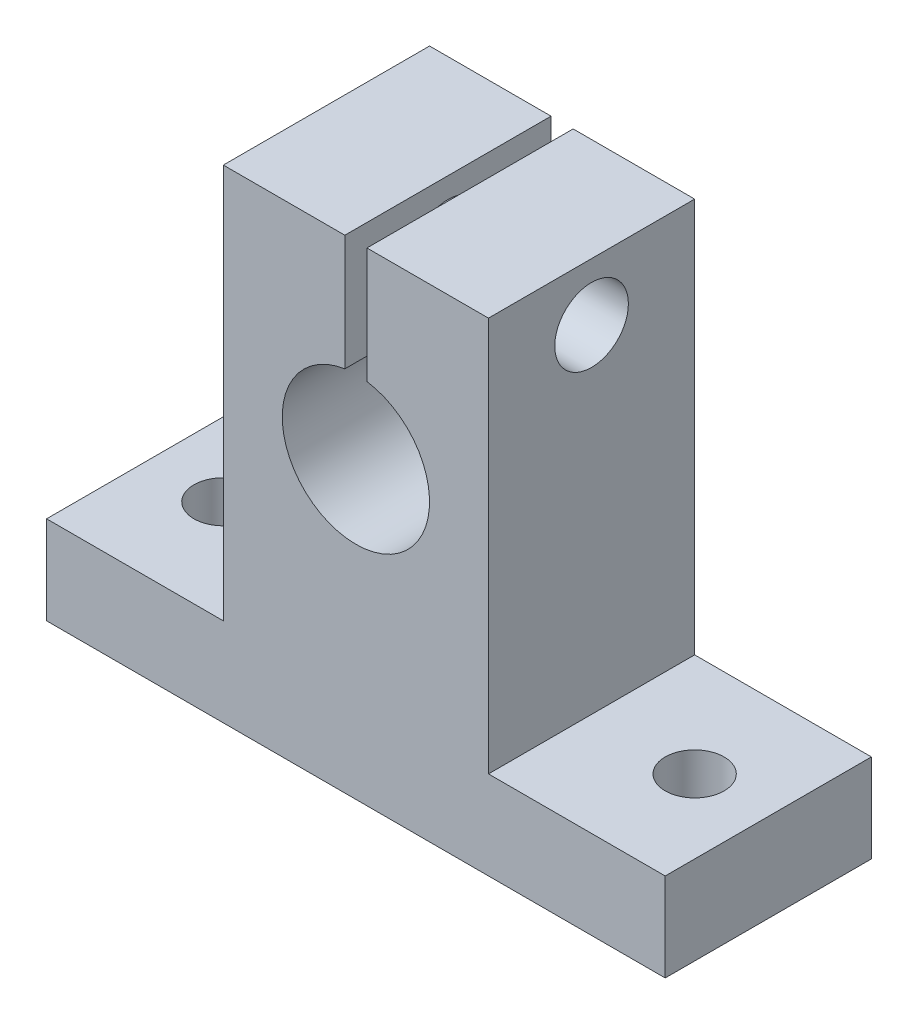
ISO-10303-21;
HEADER;
FILE_DESCRIPTION(('STEP AP214'),'2;1');
FILE_NAME('part.step','',(''),(''),'','','');
FILE_SCHEMA(('AUTOMOTIVE_DESIGN { 1 0 10303 214 1 1 1 1 }'));
ENDSEC;
DATA;
#1=APPLICATION_CONTEXT('core data for automotive mechanical design processes');
#2=APPLICATION_PROTOCOL_DEFINITION('international standard','automotive_design',2000,#1);
#3=PRODUCT_CONTEXT('',#1,'mechanical');
#4=PRODUCT('Part','Part','',(#3));
#5=PRODUCT_RELATED_PRODUCT_CATEGORY('part','',(#4));
#6=PRODUCT_DEFINITION_FORMATION('','',#4);
#7=PRODUCT_DEFINITION_CONTEXT('part definition',#1,'design');
#8=PRODUCT_DEFINITION('design','',#6,#7);
#9=PRODUCT_DEFINITION_SHAPE('','',#8);
#10=(LENGTH_UNIT() NAMED_UNIT(*) SI_UNIT(.MILLI.,.METRE.));
#11=(NAMED_UNIT(*) PLANE_ANGLE_UNIT() SI_UNIT($,.RADIAN.));
#12=(NAMED_UNIT(*) SI_UNIT($,.STERADIAN.) SOLID_ANGLE_UNIT());
#13=UNCERTAINTY_MEASURE_WITH_UNIT(LENGTH_MEASURE(1.E-05),#10,'distance_accuracy_value','');
#14=(GEOMETRIC_REPRESENTATION_CONTEXT(3) GLOBAL_UNCERTAINTY_ASSIGNED_CONTEXT((#13)) GLOBAL_UNIT_ASSIGNED_CONTEXT((#10,
#11,#12)) REPRESENTATION_CONTEXT('',''));
#15=CARTESIAN_POINT('',(0.,0.,0.));
#16=DIRECTION('',(0.,0.,1.));
#17=DIRECTION('',(1.,0.,0.));
#18=AXIS2_PLACEMENT_3D('',#15,#16,#17);
#19=CARTESIAN_POINT('',(0.749999999999995,16.4,14.));
#20=DIRECTION('',(0.,-1.,0.));
#21=DIRECTION('',(0.,0.,-1.));
#22=AXIS2_PLACEMENT_3D('',#19,#20,#21);
#23=PLANE('',#22);
#24=DIRECTION('',(-1.,0.,0.));
#25=VECTOR('',#24,1.);
#26=CARTESIAN_POINT('',(0.749999999999995,16.4,0.));
#27=LINE('',#26,#25);
#28=CARTESIAN_POINT('',(9.,16.4,0.));
#29=VERTEX_POINT('',#28);
#30=CARTESIAN_POINT('',(0.749999999999995,16.4,0.));
#31=VERTEX_POINT('',#30);
#32=EDGE_CURVE('E165',#29,#31,#27,.T.);
#33=ORIENTED_EDGE('',*,*,#32,.T.);
#34=DIRECTION('',(0.,0.,-1.));
#35=VECTOR('',#34,1.);
#36=CARTESIAN_POINT('',(0.749999999999995,16.4,14.));
#37=LINE('',#36,#35);
#38=CARTESIAN_POINT('',(0.749999999999995,16.4,14.));
#39=VERTEX_POINT('',#38);
#40=EDGE_CURVE('E11',#39,#31,#37,.T.);
#41=ORIENTED_EDGE('',*,*,#40,.F.);
#42=DIRECTION('',(-1.,0.,0.));
#43=VECTOR('',#42,1.);
#44=CARTESIAN_POINT('',(0.749999999999995,16.4,14.));
#45=LINE('',#44,#43);
#46=CARTESIAN_POINT('',(9.,16.4,14.));
#47=VERTEX_POINT('',#46);
#48=EDGE_CURVE('E200',#47,#39,#45,.T.);
#49=ORIENTED_EDGE('',*,*,#48,.F.);
#50=DIRECTION('',(0.,0.,-1.));
#51=VECTOR('',#50,1.);
#52=CARTESIAN_POINT('',(9.,16.4,14.));
#53=LINE('',#52,#51);
#54=EDGE_CURVE('E161',#47,#29,#53,.T.);
#55=ORIENTED_EDGE('',*,*,#54,.T.);
#56=EDGE_LOOP('',(#33,#41,#49,#55));
#57=FACE_BOUND('',#56,.T.);
#58=ADVANCED_FACE('F39',(#57),#23,.F.);
#59=CARTESIAN_POINT('',(0.749999999999995,8.5434299833213,14.));
#60=DIRECTION('',(1.,0.,0.));
#61=DIRECTION('',(0.,0.,-1.));
#62=AXIS2_PLACEMENT_3D('',#59,#60,#61);
#63=PLANE('',#62);
#64=CARTESIAN_POINT('',(0.749999999999994,12.5,7.));
#65=DIRECTION('',(1.,0.,0.));
#66=DIRECTION('',(0.,0.,-1.));
#67=AXIS2_PLACEMENT_3D('',#64,#65,#66);
#68=CIRCLE('',#67,2.5);
#69=CARTESIAN_POINT('',(0.749999999999994,12.5,4.5));
#70=VERTEX_POINT('',#69);
#71=EDGE_CURVE('E170',#70,#70,#68,.T.);
#72=ORIENTED_EDGE('',*,*,#71,.T.);
#73=EDGE_LOOP('',(#72));
#74=FACE_BOUND('',#73,.T.);
#75=DIRECTION('',(0.,-1.,0.));
#76=VECTOR('',#75,1.);
#77=CARTESIAN_POINT('',(0.749999999999995,8.5434299833213,0.));
#78=LINE('',#77,#76);
#79=CARTESIAN_POINT('',(0.749999999999994,8.5434299833213,0.));
#80=VERTEX_POINT('',#79);
#81=EDGE_CURVE('E169',#31,#80,#78,.T.);
#82=ORIENTED_EDGE('',*,*,#81,.T.);
#83=DIRECTION('',(0.,0.,-1.));
#84=VECTOR('',#83,1.);
#85=CARTESIAN_POINT('',(0.749999999999994,8.5434299833213,14.));
#86=LINE('',#85,#84);
#87=CARTESIAN_POINT('',(0.749999999999994,8.5434299833213,14.));
#88=VERTEX_POINT('',#87);
#89=EDGE_CURVE('E49',#88,#80,#86,.T.);
#90=ORIENTED_EDGE('',*,*,#89,.F.);
#91=DIRECTION('',(0.,-1.,0.));
#92=VECTOR('',#91,1.);
#93=CARTESIAN_POINT('',(0.749999999999995,8.5434299833213,14.));
#94=LINE('',#93,#92);
#95=EDGE_CURVE('E112',#39,#88,#94,.T.);
#96=ORIENTED_EDGE('',*,*,#95,.F.);
#97=ORIENTED_EDGE('',*,*,#40,.T.);
#98=EDGE_LOOP('',(#82,#90,#96,#97));
#99=FACE_BOUND('',#98,.T.);
#100=ADVANCED_FACE('F298',(#74,#99),#63,.F.);
#101=CARTESIAN_POINT('',(0.,3.6,14.));
#102=DIRECTION('',(0.,0.,-1.));
#103=DIRECTION('',(-1.,0.,0.));
#104=AXIS2_PLACEMENT_3D('',#101,#102,#103);
#105=CYLINDRICAL_SURFACE('',#104,5.);
#106=CARTESIAN_POINT('',(0.,3.6,0.));
#107=DIRECTION('',(0.,0.,-1.));
#108=DIRECTION('',(1.,0.,0.));
#109=AXIS2_PLACEMENT_3D('',#106,#107,#108);
#110=CIRCLE('',#109,5.);
#111=CARTESIAN_POINT('',(-0.750000000000005,8.5434299833213,0.));
#112=VERTEX_POINT('',#111);
#113=EDGE_CURVE('E173',#80,#112,#110,.T.);
#114=ORIENTED_EDGE('',*,*,#113,.T.);
#115=DIRECTION('',(0.,0.,-1.));
#116=VECTOR('',#115,1.);
#117=CARTESIAN_POINT('',(-0.750000000000005,8.5434299833213,14.));
#118=LINE('',#117,#116);
#119=CARTESIAN_POINT('',(-0.750000000000005,8.5434299833213,14.));
#120=VERTEX_POINT('',#119);
#121=EDGE_CURVE('E227',#120,#112,#118,.T.);
#122=ORIENTED_EDGE('',*,*,#121,.F.);
#123=CARTESIAN_POINT('',(0.,3.6,14.));
#124=DIRECTION('',(0.,0.,-1.));
#125=DIRECTION('',(1.,0.,0.));
#126=AXIS2_PLACEMENT_3D('',#123,#124,#125);
#127=CIRCLE('',#126,5.);
#128=EDGE_CURVE('E238',#88,#120,#127,.T.);
#129=ORIENTED_EDGE('',*,*,#128,.F.);
#130=ORIENTED_EDGE('',*,*,#89,.T.);
#131=EDGE_LOOP('',(#114,#122,#129,#130));
#132=FACE_BOUND('',#131,.T.);
#133=ADVANCED_FACE('F236',(#132),#105,.F.);
#134=CARTESIAN_POINT('',(-0.750000000000005,8.5434299833213,14.));
#135=DIRECTION('',(-1.,0.,0.));
#136=DIRECTION('',(0.,0.,1.));
#137=AXIS2_PLACEMENT_3D('',#134,#135,#136);
#138=PLANE('',#137);
#139=CARTESIAN_POINT('',(-0.750000000000004,12.5,7.));
#140=DIRECTION('',(-1.,0.,0.));
#141=DIRECTION('',(0.,0.,1.));
#142=AXIS2_PLACEMENT_3D('',#139,#140,#141);
#143=CIRCLE('',#142,2.5);
#144=CARTESIAN_POINT('',(-0.750000000000004,12.5,9.5));
#145=VERTEX_POINT('',#144);
#146=EDGE_CURVE('E454',#145,#145,#143,.T.);
#147=ORIENTED_EDGE('',*,*,#146,.T.);
#148=EDGE_LOOP('',(#147));
#149=FACE_BOUND('',#148,.T.);
#150=DIRECTION('',(0.,1.,0.));
#151=VECTOR('',#150,1.);
#152=CARTESIAN_POINT('',(-0.750000000000005,8.5434299833213,0.));
#153=LINE('',#152,#151);
#154=CARTESIAN_POINT('',(-0.750000000000005,16.4,0.));
#155=VERTEX_POINT('',#154);
#156=EDGE_CURVE('E176',#112,#155,#153,.T.);
#157=ORIENTED_EDGE('',*,*,#156,.T.);
#158=DIRECTION('',(0.,0.,-1.));
#159=VECTOR('',#158,1.);
#160=CARTESIAN_POINT('',(-0.750000000000005,16.4,14.));
#161=LINE('',#160,#159);
#162=CARTESIAN_POINT('',(-0.750000000000005,16.4,14.));
#163=VERTEX_POINT('',#162);
#164=EDGE_CURVE('E223',#163,#155,#161,.T.);
#165=ORIENTED_EDGE('',*,*,#164,.F.);
#166=DIRECTION('',(0.,1.,0.));
#167=VECTOR('',#166,1.);
#168=CARTESIAN_POINT('',(-0.750000000000005,8.5434299833213,14.));
#169=LINE('',#168,#167);
#170=EDGE_CURVE('E257',#120,#163,#169,.T.);
#171=ORIENTED_EDGE('',*,*,#170,.F.);
#172=ORIENTED_EDGE('',*,*,#121,.T.);
#173=EDGE_LOOP('',(#157,#165,#171,#172));
#174=FACE_BOUND('',#173,.T.);
#175=ADVANCED_FACE('F247',(#149,#174),#138,.F.);
#176=CARTESIAN_POINT('',(-9.,16.4,14.));
#177=DIRECTION('',(0.,-1.,0.));
#178=DIRECTION('',(0.,0.,-1.));
#179=AXIS2_PLACEMENT_3D('',#176,#177,#178);
#180=PLANE('',#179);
#181=DIRECTION('',(-1.,0.,0.));
#182=VECTOR('',#181,1.);
#183=CARTESIAN_POINT('',(-9.,16.4,0.));
#184=LINE('',#183,#182);
#185=CARTESIAN_POINT('',(-9.,16.4,0.));
#186=VERTEX_POINT('',#185);
#187=EDGE_CURVE('E179',#155,#186,#184,.T.);
#188=ORIENTED_EDGE('',*,*,#187,.T.);
#189=DIRECTION('',(0.,0.,-1.));
#190=VECTOR('',#189,1.);
#191=CARTESIAN_POINT('',(-9.,16.4,14.));
#192=LINE('',#191,#190);
#193=CARTESIAN_POINT('',(-9.,16.4,14.));
#194=VERTEX_POINT('',#193);
#195=EDGE_CURVE('E219',#194,#186,#192,.T.);
#196=ORIENTED_EDGE('',*,*,#195,.F.);
#197=DIRECTION('',(-1.,0.,0.));
#198=VECTOR('',#197,1.);
#199=CARTESIAN_POINT('',(-9.,16.4,14.));
#200=LINE('',#199,#198);
#201=EDGE_CURVE('E253',#163,#194,#200,.T.);
#202=ORIENTED_EDGE('',*,*,#201,.F.);
#203=ORIENTED_EDGE('',*,*,#164,.T.);
#204=EDGE_LOOP('',(#188,#196,#202,#203));
#205=FACE_BOUND('',#204,.T.);
#206=ADVANCED_FACE('F251',(#205),#180,.F.);
#207=CARTESIAN_POINT('',(-9.,-10.4,14.));
#208=DIRECTION('',(1.,0.,0.));
#209=DIRECTION('',(0.,0.,-1.));
#210=AXIS2_PLACEMENT_3D('',#207,#208,#209);
#211=PLANE('',#210);
#212=CARTESIAN_POINT('',(-9.,12.5,7.));
#213=DIRECTION('',(1.,0.,0.));
#214=DIRECTION('',(0.,0.,-1.));
#215=AXIS2_PLACEMENT_3D('',#212,#213,#214);
#216=CIRCLE('',#215,2.5);
#217=CARTESIAN_POINT('',(-9.,12.5,4.5));
#218=VERTEX_POINT('',#217);
#219=EDGE_CURVE('E451',#218,#218,#216,.T.);
#220=ORIENTED_EDGE('',*,*,#219,.T.);
#221=EDGE_LOOP('',(#220));
#222=FACE_BOUND('',#221,.T.);
#223=DIRECTION('',(0.,-1.,0.));
#224=VECTOR('',#223,1.);
#225=CARTESIAN_POINT('',(-9.,-10.4,0.));
#226=LINE('',#225,#224);
#227=CARTESIAN_POINT('',(-9.,-10.4,0.));
#228=VERTEX_POINT('',#227);
#229=EDGE_CURVE('E182',#186,#228,#226,.T.);
#230=ORIENTED_EDGE('',*,*,#229,.T.);
#231=DIRECTION('',(0.,0.,-1.));
#232=VECTOR('',#231,1.);
#233=CARTESIAN_POINT('',(-9.,-10.4,14.));
#234=LINE('',#233,#232);
#235=CARTESIAN_POINT('',(-9.,-10.4,14.));
#236=VERTEX_POINT('',#235);
#237=EDGE_CURVE('E215',#236,#228,#234,.T.);
#238=ORIENTED_EDGE('',*,*,#237,.F.);
#239=DIRECTION('',(0.,-1.,0.));
#240=VECTOR('',#239,1.);
#241=CARTESIAN_POINT('',(-9.,-10.4,14.));
#242=LINE('',#241,#240);
#243=EDGE_CURVE('E256',#194,#236,#242,.T.);
#244=ORIENTED_EDGE('',*,*,#243,.F.);
#245=ORIENTED_EDGE('',*,*,#195,.T.);
#246=EDGE_LOOP('',(#230,#238,#244,#245));
#247=FACE_BOUND('',#246,.T.);
#248=ADVANCED_FACE('F314',(#222,#247),#211,.F.);
#249=CARTESIAN_POINT('',(-9.,-10.4,14.));
#250=DIRECTION('',(0.,-1.,0.));
#251=DIRECTION('',(1.,0.,0.));
#252=AXIS2_PLACEMENT_3D('',#249,#250,#251);
#253=PLANE('',#252);
#254=CARTESIAN_POINT('',(-16.,-10.4,7.));
#255=DIRECTION('',(0.,1.,0.));
#256=DIRECTION('',(-1.,0.,0.));
#257=AXIS2_PLACEMENT_3D('',#254,#255,#256);
#258=CIRCLE('',#257,2.);
#259=CARTESIAN_POINT('',(-18.,-10.4,7.));
#260=VERTEX_POINT('',#259);
#261=EDGE_CURVE('E475',#260,#260,#258,.T.);
#262=ORIENTED_EDGE('',*,*,#261,.F.);
#263=EDGE_LOOP('',(#262));
#264=FACE_BOUND('',#263,.T.);
#265=DIRECTION('',(-1.,0.,0.));
#266=VECTOR('',#265,1.);
#267=CARTESIAN_POINT('',(-9.,-10.4,0.));
#268=LINE('',#267,#266);
#269=CARTESIAN_POINT('',(-21.,-10.4,0.));
#270=VERTEX_POINT('',#269);
#271=EDGE_CURVE('E185',#228,#270,#268,.T.);
#272=ORIENTED_EDGE('',*,*,#271,.T.);
#273=DIRECTION('',(0.,0.,-1.));
#274=VECTOR('',#273,1.);
#275=CARTESIAN_POINT('',(-21.,-10.4,14.));
#276=LINE('',#275,#274);
#277=CARTESIAN_POINT('',(-21.,-10.4,14.));
#278=VERTEX_POINT('',#277);
#279=EDGE_CURVE('E211',#278,#270,#276,.T.);
#280=ORIENTED_EDGE('',*,*,#279,.F.);
#281=DIRECTION('',(-1.,0.,0.));
#282=VECTOR('',#281,1.);
#283=CARTESIAN_POINT('',(-9.,-10.4,14.));
#284=LINE('',#283,#282);
#285=EDGE_CURVE('E261',#236,#278,#284,.T.);
#286=ORIENTED_EDGE('',*,*,#285,.F.);
#287=ORIENTED_EDGE('',*,*,#237,.T.);
#288=EDGE_LOOP('',(#272,#280,#286,#287));
#289=FACE_BOUND('',#288,.T.);
#290=ADVANCED_FACE('F317',(#264,#289),#253,.F.);
#291=CARTESIAN_POINT('',(-21.,-16.4,14.));
#292=DIRECTION('',(1.,0.,0.));
#293=DIRECTION('',(0.,0.,-1.));
#294=AXIS2_PLACEMENT_3D('',#291,#292,#293);
#295=PLANE('',#294);
#296=DIRECTION('',(0.,-1.,0.));
#297=VECTOR('',#296,1.);
#298=CARTESIAN_POINT('',(-21.,-16.4,0.));
#299=LINE('',#298,#297);
#300=CARTESIAN_POINT('',(-21.,-16.4,0.));
#301=VERTEX_POINT('',#300);
#302=EDGE_CURVE('E188',#270,#301,#299,.T.);
#303=ORIENTED_EDGE('',*,*,#302,.T.);
#304=DIRECTION('',(0.,0.,-1.));
#305=VECTOR('',#304,1.);
#306=CARTESIAN_POINT('',(-21.,-16.4,14.));
#307=LINE('',#306,#305);
#308=CARTESIAN_POINT('',(-21.,-16.4,14.));
#309=VERTEX_POINT('',#308);
#310=EDGE_CURVE('E207',#309,#301,#307,.T.);
#311=ORIENTED_EDGE('',*,*,#310,.F.);
#312=DIRECTION('',(0.,-1.,0.));
#313=VECTOR('',#312,1.);
#314=CARTESIAN_POINT('',(-21.,-16.4,14.));
#315=LINE('',#314,#313);
#316=EDGE_CURVE('E268',#278,#309,#315,.T.);
#317=ORIENTED_EDGE('',*,*,#316,.F.);
#318=ORIENTED_EDGE('',*,*,#279,.T.);
#319=EDGE_LOOP('',(#303,#311,#317,#318));
#320=FACE_BOUND('',#319,.T.);
#321=ADVANCED_FACE('F276',(#320),#295,.F.);
#322=CARTESIAN_POINT('',(-21.,-16.4,14.));
#323=DIRECTION('',(0.,1.,0.));
#324=DIRECTION('',(0.,0.,1.));
#325=AXIS2_PLACEMENT_3D('',#322,#323,#324);
#326=PLANE('',#325);
#327=CARTESIAN_POINT('',(-16.,-16.4,7.));
#328=DIRECTION('',(0.,1.,0.));
#329=DIRECTION('',(0.,0.,1.));
#330=AXIS2_PLACEMENT_3D('',#327,#328,#329);
#331=CIRCLE('',#330,2.);
#332=CARTESIAN_POINT('',(-16.,-16.4,9.));
#333=VERTEX_POINT('',#332);
#334=EDGE_CURVE('E42',#333,#333,#331,.T.);
#335=ORIENTED_EDGE('',*,*,#334,.T.);
#336=EDGE_LOOP('',(#335));
#337=FACE_BOUND('',#336,.T.);
#338=CARTESIAN_POINT('',(16.,-16.4,7.));
#339=DIRECTION('',(0.,1.,0.));
#340=DIRECTION('',(0.,0.,1.));
#341=AXIS2_PLACEMENT_3D('',#338,#339,#340);
#342=CIRCLE('',#341,2.);
#343=CARTESIAN_POINT('',(16.,-16.4,9.));
#344=VERTEX_POINT('',#343);
#345=EDGE_CURVE('E471',#344,#344,#342,.T.);
#346=ORIENTED_EDGE('',*,*,#345,.T.);
#347=EDGE_LOOP('',(#346));
#348=FACE_BOUND('',#347,.T.);
#349=DIRECTION('',(1.,0.,0.));
#350=VECTOR('',#349,1.);
#351=CARTESIAN_POINT('',(-21.,-16.4,0.));
#352=LINE('',#351,#350);
#353=CARTESIAN_POINT('',(21.,-16.4,0.));
#354=VERTEX_POINT('',#353);
#355=EDGE_CURVE('E191',#301,#354,#352,.T.);
#356=ORIENTED_EDGE('',*,*,#355,.T.);
#357=DIRECTION('',(0.,0.,-1.));
#358=VECTOR('',#357,1.);
#359=CARTESIAN_POINT('',(21.,-16.4,14.));
#360=LINE('',#359,#358);
#361=CARTESIAN_POINT('',(21.,-16.4,14.));
#362=VERTEX_POINT('',#361);
#363=EDGE_CURVE('E154',#362,#354,#360,.T.);
#364=ORIENTED_EDGE('',*,*,#363,.F.);
#365=DIRECTION('',(1.,0.,0.));
#366=VECTOR('',#365,1.);
#367=CARTESIAN_POINT('',(-21.,-16.4,14.));
#368=LINE('',#367,#366);
#369=EDGE_CURVE('E143',#309,#362,#368,.T.);
#370=ORIENTED_EDGE('',*,*,#369,.F.);
#371=ORIENTED_EDGE('',*,*,#310,.T.);
#372=EDGE_LOOP('',(#356,#364,#370,#371));
#373=FACE_BOUND('',#372,.T.);
#374=ADVANCED_FACE('F280',(#337,#348,#373),#326,.F.);
#375=CARTESIAN_POINT('',(21.,-16.4,14.));
#376=DIRECTION('',(-1.,0.,0.));
#377=DIRECTION('',(0.,0.,1.));
#378=AXIS2_PLACEMENT_3D('',#375,#376,#377);
#379=PLANE('',#378);
#380=DIRECTION('',(0.,1.,0.));
#381=VECTOR('',#380,1.);
#382=CARTESIAN_POINT('',(21.,-16.4,0.));
#383=LINE('',#382,#381);
#384=CARTESIAN_POINT('',(21.,-10.4,0.));
#385=VERTEX_POINT('',#384);
#386=EDGE_CURVE('E152',#354,#385,#383,.T.);
#387=ORIENTED_EDGE('',*,*,#386,.T.);
#388=DIRECTION('',(0.,0.,-1.));
#389=VECTOR('',#388,1.);
#390=CARTESIAN_POINT('',(21.,-10.4,14.));
#391=LINE('',#390,#389);
#392=CARTESIAN_POINT('',(21.,-10.4,14.));
#393=VERTEX_POINT('',#392);
#394=EDGE_CURVE('E149',#393,#385,#391,.T.);
#395=ORIENTED_EDGE('',*,*,#394,.F.);
#396=DIRECTION('',(0.,1.,0.));
#397=VECTOR('',#396,1.);
#398=CARTESIAN_POINT('',(21.,-16.4,14.));
#399=LINE('',#398,#397);
#400=EDGE_CURVE('E137',#362,#393,#399,.T.);
#401=ORIENTED_EDGE('',*,*,#400,.F.);
#402=ORIENTED_EDGE('',*,*,#363,.T.);
#403=EDGE_LOOP('',(#387,#395,#401,#402));
#404=FACE_BOUND('',#403,.T.);
#405=ADVANCED_FACE('F150',(#404),#379,.F.);
#406=CARTESIAN_POINT('',(9.,-10.4,14.));
#407=DIRECTION('',(0.,-1.,0.));
#408=DIRECTION('',(1.,0.,0.));
#409=AXIS2_PLACEMENT_3D('',#406,#407,#408);
#410=PLANE('',#409);
#411=CARTESIAN_POINT('',(16.,-10.4,7.));
#412=DIRECTION('',(0.,1.,0.));
#413=DIRECTION('',(-1.,0.,0.));
#414=AXIS2_PLACEMENT_3D('',#411,#412,#413);
#415=CIRCLE('',#414,2.);
#416=CARTESIAN_POINT('',(14.,-10.4,7.));
#417=VERTEX_POINT('',#416);
#418=EDGE_CURVE('E476',#417,#417,#415,.T.);
#419=ORIENTED_EDGE('',*,*,#418,.F.);
#420=EDGE_LOOP('',(#419));
#421=FACE_BOUND('',#420,.T.);
#422=DIRECTION('',(-1.,0.,0.));
#423=VECTOR('',#422,1.);
#424=CARTESIAN_POINT('',(9.,-10.4,0.));
#425=LINE('',#424,#423);
#426=CARTESIAN_POINT('',(9.,-10.4,0.));
#427=VERTEX_POINT('',#426);
#428=EDGE_CURVE('E98',#385,#427,#425,.T.);
#429=ORIENTED_EDGE('',*,*,#428,.T.);
#430=DIRECTION('',(0.,0.,-1.));
#431=VECTOR('',#430,1.);
#432=CARTESIAN_POINT('',(9.,-10.4,14.));
#433=LINE('',#432,#431);
#434=CARTESIAN_POINT('',(9.,-10.4,14.));
#435=VERTEX_POINT('',#434);
#436=EDGE_CURVE('E155',#435,#427,#433,.T.);
#437=ORIENTED_EDGE('',*,*,#436,.F.);
#438=DIRECTION('',(-1.,0.,0.));
#439=VECTOR('',#438,1.);
#440=CARTESIAN_POINT('',(9.,-10.4,14.));
#441=LINE('',#440,#439);
#442=EDGE_CURVE('E141',#393,#435,#441,.T.);
#443=ORIENTED_EDGE('',*,*,#442,.F.);
#444=ORIENTED_EDGE('',*,*,#394,.T.);
#445=EDGE_LOOP('',(#429,#437,#443,#444));
#446=FACE_BOUND('',#445,.T.);
#447=ADVANCED_FACE('F157',(#421,#446),#410,.F.);
#448=CARTESIAN_POINT('',(9.,-10.4,14.));
#449=DIRECTION('',(-1.,0.,0.));
#450=DIRECTION('',(0.,0.,1.));
#451=AXIS2_PLACEMENT_3D('',#448,#449,#450);
#452=PLANE('',#451);
#453=CARTESIAN_POINT('',(9.,12.5,7.));
#454=DIRECTION('',(1.,0.,0.));
#455=DIRECTION('',(0.,0.,-1.));
#456=AXIS2_PLACEMENT_3D('',#453,#454,#455);
#457=CIRCLE('',#456,2.5);
#458=CARTESIAN_POINT('',(9.,12.5,4.5));
#459=VERTEX_POINT('',#458);
#460=EDGE_CURVE('E460',#459,#459,#457,.T.);
#461=ORIENTED_EDGE('',*,*,#460,.F.);
#462=EDGE_LOOP('',(#461));
#463=FACE_BOUND('',#462,.T.);
#464=DIRECTION('',(0.,1.,0.));
#465=VECTOR('',#464,1.);
#466=CARTESIAN_POINT('',(9.,-10.4,0.));
#467=LINE('',#466,#465);
#468=EDGE_CURVE('E104',#427,#29,#467,.T.);
#469=ORIENTED_EDGE('',*,*,#468,.T.);
#470=ORIENTED_EDGE('',*,*,#54,.F.);
#471=DIRECTION('',(0.,1.,0.));
#472=VECTOR('',#471,1.);
#473=CARTESIAN_POINT('',(9.,-10.4,14.));
#474=LINE('',#473,#472);
#475=EDGE_CURVE('E57',#435,#47,#474,.T.);
#476=ORIENTED_EDGE('',*,*,#475,.F.);
#477=ORIENTED_EDGE('',*,*,#436,.T.);
#478=EDGE_LOOP('',(#469,#470,#476,#477));
#479=FACE_BOUND('',#478,.T.);
#480=ADVANCED_FACE('F284',(#463,#479),#452,.F.);
#481=CARTESIAN_POINT('',(0.,3.6,14.));
#482=DIRECTION('',(0.,0.,1.));
#483=DIRECTION('',(1.,0.,0.));
#484=AXIS2_PLACEMENT_3D('',#481,#482,#483);
#485=PLANE('',#484);
#486=ORIENTED_EDGE('',*,*,#48,.T.);
#487=ORIENTED_EDGE('',*,*,#95,.T.);
#488=ORIENTED_EDGE('',*,*,#128,.T.);
#489=ORIENTED_EDGE('',*,*,#170,.T.);
#490=ORIENTED_EDGE('',*,*,#201,.T.);
#491=ORIENTED_EDGE('',*,*,#243,.T.);
#492=ORIENTED_EDGE('',*,*,#285,.T.);
#493=ORIENTED_EDGE('',*,*,#316,.T.);
#494=ORIENTED_EDGE('',*,*,#369,.T.);
#495=ORIENTED_EDGE('',*,*,#400,.T.);
#496=ORIENTED_EDGE('',*,*,#442,.T.);
#497=ORIENTED_EDGE('',*,*,#475,.T.);
#498=EDGE_LOOP('',(#486,#487,#488,#489,#490,#491,#492,#493,#494,#495,#496,#497));
#499=FACE_BOUND('',#498,.T.);
#500=ADVANCED_FACE('F139',(#499),#485,.T.);
#501=CARTESIAN_POINT('',(0.,3.6,0.));
#502=DIRECTION('',(0.,0.,1.));
#503=DIRECTION('',(1.,0.,0.));
#504=AXIS2_PLACEMENT_3D('',#501,#502,#503);
#505=PLANE('',#504);
#506=ORIENTED_EDGE('',*,*,#32,.F.);
#507=ORIENTED_EDGE('',*,*,#468,.F.);
#508=ORIENTED_EDGE('',*,*,#428,.F.);
#509=ORIENTED_EDGE('',*,*,#386,.F.);
#510=ORIENTED_EDGE('',*,*,#355,.F.);
#511=ORIENTED_EDGE('',*,*,#302,.F.);
#512=ORIENTED_EDGE('',*,*,#271,.F.);
#513=ORIENTED_EDGE('',*,*,#229,.F.);
#514=ORIENTED_EDGE('',*,*,#187,.F.);
#515=ORIENTED_EDGE('',*,*,#156,.F.);
#516=ORIENTED_EDGE('',*,*,#113,.F.);
#517=ORIENTED_EDGE('',*,*,#81,.F.);
#518=EDGE_LOOP('',(#506,#507,#508,#509,#510,#511,#512,#513,#514,#515,#516,#517));
#519=FACE_BOUND('',#518,.T.);
#520=ADVANCED_FACE('F242',(#519),#505,.F.);
#521=CARTESIAN_POINT('',(-21.,12.5,7.));
#522=DIRECTION('',(1.,0.,0.));
#523=DIRECTION('',(0.,0.,-1.));
#524=AXIS2_PLACEMENT_3D('',#521,#522,#523);
#525=CYLINDRICAL_SURFACE('',#524,2.5);
#526=ORIENTED_EDGE('',*,*,#460,.T.);
#527=EDGE_LOOP('',(#526));
#528=FACE_BOUND('',#527,.T.);
#529=ORIENTED_EDGE('',*,*,#71,.F.);
#530=EDGE_LOOP('',(#529));
#531=FACE_BOUND('',#530,.T.);
#532=ADVANCED_FACE('F372',(#528,#531),#525,.F.);
#533=ORIENTED_EDGE('',*,*,#219,.F.);
#534=EDGE_LOOP('',(#533));
#535=FACE_BOUND('',#534,.T.);
#536=ORIENTED_EDGE('',*,*,#146,.F.);
#537=EDGE_LOOP('',(#536));
#538=FACE_BOUND('',#537,.T.);
#539=ADVANCED_FACE('F353',(#535,#538),#525,.F.);
#540=CARTESIAN_POINT('',(16.,-24.4,7.));
#541=DIRECTION('',(0.,1.,0.));
#542=DIRECTION('',(-1.,0.,0.));
#543=AXIS2_PLACEMENT_3D('',#540,#541,#542);
#544=CYLINDRICAL_SURFACE('',#543,2.);
#545=ORIENTED_EDGE('',*,*,#418,.T.);
#546=EDGE_LOOP('',(#545));
#547=FACE_BOUND('',#546,.T.);
#548=ORIENTED_EDGE('',*,*,#345,.F.);
#549=EDGE_LOOP('',(#548));
#550=FACE_BOUND('',#549,.T.);
#551=ADVANCED_FACE('F347',(#547,#550),#544,.F.);
#552=CARTESIAN_POINT('',(-16.,-24.4,7.));
#553=DIRECTION('',(0.,1.,0.));
#554=DIRECTION('',(-1.,0.,0.));
#555=AXIS2_PLACEMENT_3D('',#552,#553,#554);
#556=CYLINDRICAL_SURFACE('',#555,2.);
#557=ORIENTED_EDGE('',*,*,#261,.T.);
#558=EDGE_LOOP('',(#557));
#559=FACE_BOUND('',#558,.T.);
#560=ORIENTED_EDGE('',*,*,#334,.F.);
#561=EDGE_LOOP('',(#560));
#562=FACE_BOUND('',#561,.T.);
#563=ADVANCED_FACE('F352',(#559,#562),#556,.F.);
#564=CLOSED_SHELL('',(#58,#100,#133,#175,#206,#248,#290,#321,#374,#405,#447,#480,#500,#520,#532,
#539,#551,#563));
#565=MANIFOLD_SOLID_BREP('B2',#564);
#566=ADVANCED_BREP_SHAPE_REPRESENTATION('',(#18,#565),#14);
#567=SHAPE_DEFINITION_REPRESENTATION(#9,#566);
ENDSEC;
END-ISO-10303-21;
